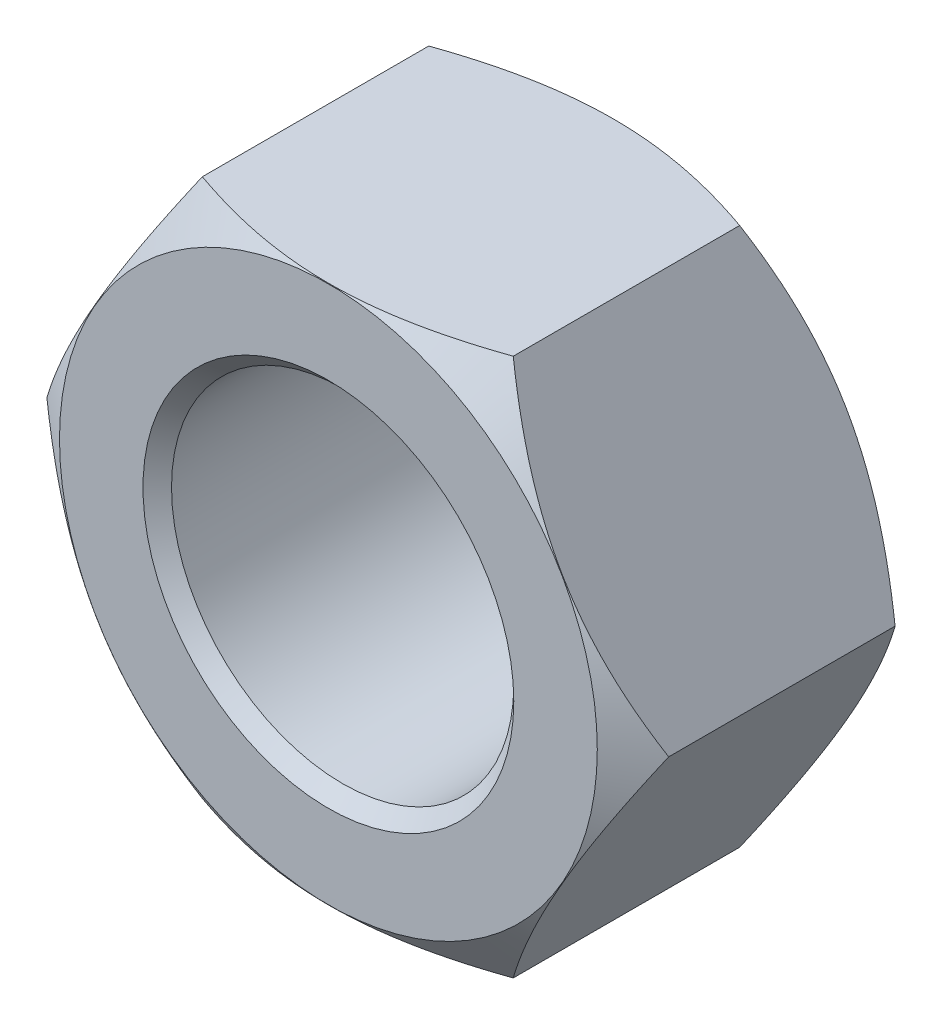
ISO-10303-21;
HEADER;
FILE_DESCRIPTION(('STEP AP214'),'2;1');
FILE_NAME('part.step','',(''),(''),'','','');
FILE_SCHEMA(('AUTOMOTIVE_DESIGN { 1 0 10303 214 1 1 1 1 }'));
ENDSEC;
DATA;
#1=APPLICATION_CONTEXT('core data for automotive mechanical design processes');
#2=APPLICATION_PROTOCOL_DEFINITION('international standard','automotive_design',2000,#1);
#3=PRODUCT_CONTEXT('',#1,'mechanical');
#4=PRODUCT('Part','Part','',(#3));
#5=PRODUCT_RELATED_PRODUCT_CATEGORY('part','',(#4));
#6=PRODUCT_DEFINITION_FORMATION('','',#4);
#7=PRODUCT_DEFINITION_CONTEXT('part definition',#1,'design');
#8=PRODUCT_DEFINITION('design','',#6,#7);
#9=PRODUCT_DEFINITION_SHAPE('','',#8);
#10=(LENGTH_UNIT() NAMED_UNIT(*) SI_UNIT(.MILLI.,.METRE.));
#11=(NAMED_UNIT(*) PLANE_ANGLE_UNIT() SI_UNIT($,.RADIAN.));
#12=(NAMED_UNIT(*) SI_UNIT($,.STERADIAN.) SOLID_ANGLE_UNIT());
#13=UNCERTAINTY_MEASURE_WITH_UNIT(LENGTH_MEASURE(1.E-05),#10,'distance_accuracy_value','');
#14=(GEOMETRIC_REPRESENTATION_CONTEXT(3) GLOBAL_UNCERTAINTY_ASSIGNED_CONTEXT((#13)) GLOBAL_UNIT_ASSIGNED_CONTEXT((#10,
#11,#12)) REPRESENTATION_CONTEXT('',''));
#15=CARTESIAN_POINT('',(0.,0.,0.));
#16=DIRECTION('',(0.,0.,1.));
#17=DIRECTION('',(1.,0.,0.));
#18=AXIS2_PLACEMENT_3D('',#15,#16,#17);
#19=CARTESIAN_POINT('',(5.45,0.,5.));
#20=DIRECTION('',(0.,0.,1.));
#21=DIRECTION('',(1.,0.,0.));
#22=AXIS2_PLACEMENT_3D('',#19,#20,#21);
#23=PLANE('',#22);
#24=CARTESIAN_POINT('',(0.,0.,5.));
#25=DIRECTION('',(0.,0.,1.));
#26=DIRECTION('',(1.,0.,0.));
#27=AXIS2_PLACEMENT_3D('',#24,#25,#26);
#28=CIRCLE('',#27,3.25);
#29=CARTESIAN_POINT('',(3.25,0.,5.));
#30=VERTEX_POINT('',#29);
#31=EDGE_CURVE('E94',#30,#30,#28,.F.);
#32=ORIENTED_EDGE('',*,*,#31,.T.);
#33=EDGE_LOOP('',(#32));
#34=FACE_BOUND('',#33,.T.);
#35=CARTESIAN_POINT('',(0.,0.,5.));
#36=DIRECTION('',(0.,0.,1.));
#37=DIRECTION('',(1.,0.,0.));
#38=AXIS2_PLACEMENT_3D('',#35,#36,#37);
#39=CIRCLE('',#38,4.71407400337105);
#40=CARTESIAN_POINT('',(4.71407400337105,0.,5.));
#41=VERTEX_POINT('',#40);
#42=EDGE_CURVE('E109',#41,#41,#39,.T.);
#43=ORIENTED_EDGE('',*,*,#42,.T.);
#44=EDGE_LOOP('',(#43));
#45=FACE_BOUND('',#44,.T.);
#46=ADVANCED_FACE('F31',(#34,#45),#23,.T.);
#47=CARTESIAN_POINT('',(5.45,0.,0.));
#48=DIRECTION('',(0.,0.,1.));
#49=DIRECTION('',(1.,0.,0.));
#50=AXIS2_PLACEMENT_3D('',#47,#48,#49);
#51=PLANE('',#50);
#52=CARTESIAN_POINT('',(0.,0.,0.));
#53=DIRECTION('',(0.,0.,1.));
#54=DIRECTION('',(1.,0.,0.));
#55=AXIS2_PLACEMENT_3D('',#52,#53,#54);
#56=CIRCLE('',#55,3.25);
#57=CARTESIAN_POINT('',(3.25,0.,0.));
#58=VERTEX_POINT('',#57);
#59=EDGE_CURVE('E121',#58,#58,#56,.T.);
#60=ORIENTED_EDGE('',*,*,#59,.T.);
#61=EDGE_LOOP('',(#60));
#62=FACE_BOUND('',#61,.T.);
#63=CARTESIAN_POINT('',(0.,0.,0.));
#64=DIRECTION('',(0.,0.,1.));
#65=DIRECTION('',(1.,0.,0.));
#66=AXIS2_PLACEMENT_3D('',#63,#64,#65);
#67=CIRCLE('',#66,4.71407400337105);
#68=CARTESIAN_POINT('',(4.71407400337105,0.,0.));
#69=VERTEX_POINT('',#68);
#70=EDGE_CURVE('E162',#69,#69,#67,.T.);
#71=ORIENTED_EDGE('',*,*,#70,.F.);
#72=EDGE_LOOP('',(#71));
#73=FACE_BOUND('',#72,.T.);
#74=ADVANCED_FACE('F141',(#62,#73),#51,.F.);
#75=CARTESIAN_POINT('',(0.,0.,5.));
#76=DIRECTION('',(0.,0.,-1.));
#77=DIRECTION('',(-1.,0.,0.));
#78=AXIS2_PLACEMENT_3D('',#75,#76,#77);
#79=CYLINDRICAL_SURFACE('',#78,3.);
#80=CARTESIAN_POINT('',(0.,0.,0.250000000000002));
#81=DIRECTION('',(0.,0.,1.));
#82=DIRECTION('',(1.,0.,0.));
#83=AXIS2_PLACEMENT_3D('',#80,#81,#82);
#84=CIRCLE('',#83,3.);
#85=CARTESIAN_POINT('',(3.,0.,0.250000000000002));
#86=VERTEX_POINT('',#85);
#87=EDGE_CURVE('E127',#86,#86,#84,.F.);
#88=ORIENTED_EDGE('',*,*,#87,.T.);
#89=EDGE_LOOP('',(#88));
#90=FACE_BOUND('',#89,.T.);
#91=CARTESIAN_POINT('',(0.,0.,4.75));
#92=DIRECTION('',(0.,0.,1.));
#93=DIRECTION('',(1.,0.,0.));
#94=AXIS2_PLACEMENT_3D('',#91,#92,#93);
#95=CIRCLE('',#94,3.);
#96=CARTESIAN_POINT('',(3.,0.,4.75));
#97=VERTEX_POINT('',#96);
#98=EDGE_CURVE('E124',#97,#97,#95,.T.);
#99=ORIENTED_EDGE('',*,*,#98,.T.);
#100=EDGE_LOOP('',(#99));
#101=FACE_BOUND('',#100,.T.);
#102=ADVANCED_FACE('F172',(#90,#101),#79,.F.);
#103=CARTESIAN_POINT('',(0.,0.,0.));
#104=DIRECTION('',(0.,0.,-1.));
#105=DIRECTION('',(-1.,0.,0.));
#106=AXIS2_PLACEMENT_3D('',#103,#104,#105);
#107=CONICAL_SURFACE('',#106,3.25,0.785398163397447);
#108=ORIENTED_EDGE('',*,*,#87,.F.);
#109=EDGE_LOOP('',(#108));
#110=FACE_BOUND('',#109,.T.);
#111=ORIENTED_EDGE('',*,*,#59,.F.);
#112=EDGE_LOOP('',(#111));
#113=FACE_BOUND('',#112,.T.);
#114=ADVANCED_FACE('F226',(#110,#113),#107,.F.);
#115=CARTESIAN_POINT('',(0.,0.,4.75));
#116=DIRECTION('',(0.,0.,1.));
#117=DIRECTION('',(1.,0.,0.));
#118=AXIS2_PLACEMENT_3D('',#115,#116,#117);
#119=CONICAL_SURFACE('',#118,3.,0.785398163397448);
#120=ORIENTED_EDGE('',*,*,#31,.F.);
#121=EDGE_LOOP('',(#120));
#122=FACE_BOUND('',#121,.T.);
#123=ORIENTED_EDGE('',*,*,#98,.F.);
#124=EDGE_LOOP('',(#123));
#125=FACE_BOUND('',#124,.T.);
#126=ADVANCED_FACE('F33',(#122,#125),#119,.F.);
#127=CARTESIAN_POINT('',(0.,0.,1.));
#128=DIRECTION('',(0.,0.,1.));
#129=DIRECTION('',(1.,0.,0.));
#130=AXIS2_PLACEMENT_3D('',#127,#128,#129);
#131=CONICAL_SURFACE('',#130,6.14222201011317,0.95993108859688);
#132=CARTESIAN_POINT('',(5.45011547005384,0.000200000000000892,0.51538178597573));
#133=CARTESIAN_POINT('',(5.32806298266113,-0.211201109354333,0.429875257771128));
#134=CARTESIAN_POINT('',(5.20441713391848,-0.425362001521569,0.351910218977452));
#135=CARTESIAN_POINT('',(4.95392092792557,-0.859234157404532,0.216021999788678));
#136=CARTESIAN_POINT('',(4.82706001745258,-1.0789636998382,0.158177582190663));
#137=CARTESIAN_POINT('',(4.63737775386296,-1.40750301767009,0.0915313335967001));
#138=CARTESIAN_POINT('',(4.57542778506908,-1.51480351114841,0.072847142210808));
#139=CARTESIAN_POINT('',(4.45113107877919,-1.73009172165595,0.0419433362488983));
#140=CARTESIAN_POINT('',(4.38878439782671,-1.83807934074893,0.0297228204039585));
#141=CARTESIAN_POINT('',(4.26396491361934,-2.05427302917065,0.0121245032834261));
#142=CARTESIAN_POINT('',(4.20149256858239,-2.16247830484261,0.00673386676484949));
#143=CARTESIAN_POINT('',(4.07650160442724,-2.37896900524636,0.00291227577913815));
#144=CARTESIAN_POINT('',(4.01398298812395,-2.48725442510255,0.00448092797565311));
#145=CARTESIAN_POINT('',(3.84850745573006,-2.77386645461829,0.0178251994942957));
#146=CARTESIAN_POINT('',(3.74565888362815,-2.95200540698469,0.035568412628076));
#147=CARTESIAN_POINT('',(3.54098563101521,-3.3065098794607,0.0885627146286807));
#148=CARTESIAN_POINT('',(3.43916259431045,-3.48287255241429,0.123838396457758));
#149=CARTESIAN_POINT('',(3.23397262247909,-3.83827200882984,0.210793032657014));
#150=CARTESIAN_POINT('',(3.13065789606793,-4.01721836414404,0.26295312718257));
#151=CARTESIAN_POINT('',(2.92619767293136,-4.37135385874345,0.380205016519062));
#152=CARTESIAN_POINT('',(2.82504662984925,-4.54655260460024,0.445257815681375));
#153=CARTESIAN_POINT('',(2.72488452994616,-4.72003845062519,0.51538178597573));
#154=B_SPLINE_CURVE_WITH_KNOTS('',3,(#132,#133,#134,#135,#136,#137,#138,#139,#140,#141,#142,
#143,#144,#145,#146,#147,#148,#149,#150,#151,#152,#153),.UNSPECIFIED.,.F.,.F.,(4,2,2,2,2,2,2,2,
2,2,4),(0.,0.776646405136946,1.55629967817505,1.93204572645042,2.30773936838684,
2.68272592513404,3.05769128805375,3.67619229306085,4.29556333435562,4.93442007936059,
5.57137322523636),.UNSPECIFIED.);
#155=CARTESIAN_POINT('',(5.45,0.,0.515300930404081));
#156=VERTEX_POINT('',#155);
#157=CARTESIAN_POINT('',(2.725,-4.71983845062519,0.515300930404081));
#158=VERTEX_POINT('',#157);
#159=EDGE_CURVE('E58',#156,#158,#154,.T.);
#160=ORIENTED_EDGE('',*,*,#159,.T.);
#161=CARTESIAN_POINT('',(-6.81549933400218,-4.71983845062519,2.50405107916546));
#162=CARTESIAN_POINT('',(-6.6319363758131,-4.71983845062519,2.39841045528963));
#163=CARTESIAN_POINT('',(-6.44779063980697,-4.71983845062519,2.29376557052065));
#164=CARTESIAN_POINT('',(-6.07804770974955,-4.71983845062519,2.08699233797309));
#165=CARTESIAN_POINT('',(-5.89245024895761,-4.71983845062519,1.98486446769545));
#166=CARTESIAN_POINT('',(-5.51840173102368,-4.71983845062519,1.78305106920375));
#167=CARTESIAN_POINT('',(-5.32994003377949,-4.71983845062519,1.68338519449122));
#168=CARTESIAN_POINT('',(-4.95101644919157,-4.71983845062519,1.48794469056976));
#169=CARTESIAN_POINT('',(-4.76055467263069,-4.71983845062519,1.39216984725539));
#170=CARTESIAN_POINT('',(-4.36897357823232,-4.71983845062519,1.20146388132905));
#171=CARTESIAN_POINT('',(-4.16774907135716,-4.71983845062519,1.10674758325985));
#172=CARTESIAN_POINT('',(-3.76219564181353,-4.71983845062519,0.924089696253005));
#173=CARTESIAN_POINT('',(-3.5578663151275,-4.71983845062519,0.836148998193066));
#174=CARTESIAN_POINT('',(-3.14610810049009,-4.71983845062519,0.669214402409238));
#175=CARTESIAN_POINT('',(-2.93868760060408,-4.71983845062519,0.590200016477395));
#176=CARTESIAN_POINT('',(-2.51993891353004,-4.71983845062519,0.443423810913389));
#177=CARTESIAN_POINT('',(-2.30861217801651,-4.71983845062519,0.375657900868084));
#178=CARTESIAN_POINT('',(-1.87203026844753,-4.71983845062519,0.251631862891754));
#179=CARTESIAN_POINT('',(-1.64658078996976,-4.71983845062519,0.196041924758221));
#180=CARTESIAN_POINT('',(-1.19170777967253,-4.71983845062519,0.104347645205094));
#181=CARTESIAN_POINT('',(-0.962285201331706,-4.71983845062519,0.0682386937581597));
#182=CARTESIAN_POINT('',(-0.504921020782125,-4.71983845062519,0.0191970388569941));
#183=CARTESIAN_POINT('',(-0.277022498127075,-4.71983845062519,0.00587406924510309));
#184=CARTESIAN_POINT('',(0.178961293247323,-4.71983845062519,0.00255518323427895));
#185=CARTESIAN_POINT('',(0.407046573883507,-4.71983845062519,0.0125608939678147));
#186=CARTESIAN_POINT('',(0.889730645580036,-4.71983845062519,0.057559758684813));
#187=CARTESIAN_POINT('',(1.14404475263258,-4.71983845062519,0.09554559954367));
#188=CARTESIAN_POINT('',(1.64788248279505,-4.71983845062519,0.195566732685661));
#189=CARTESIAN_POINT('',(1.89740366002046,-4.71983845062519,0.257613978619117));
#190=CARTESIAN_POINT('',(2.27050156837408,-4.71983845062519,0.365664494369776));
#191=CARTESIAN_POINT('',(2.39616157438818,-4.71983845062519,0.404737841358382));
#192=CARTESIAN_POINT('',(2.64606954541901,-4.71983845062519,0.487183364770451));
#193=CARTESIAN_POINT('',(2.77031749850196,-4.71983845062519,0.530555577495182));
#194=CARTESIAN_POINT('',(3.01742528016857,-4.71983845062519,0.620996825071467));
#195=CARTESIAN_POINT('',(3.1402853643281,-4.71983845062519,0.668065166155714));
#196=CARTESIAN_POINT('',(3.38472768943608,-4.71983845062519,0.765390049101635));
#197=CARTESIAN_POINT('',(3.50630996411629,-4.71983845062519,0.815646506555352));
#198=CARTESIAN_POINT('',(3.83727485410404,-4.71983845062519,0.956856715542681));
#199=CARTESIAN_POINT('',(4.04548309212691,-4.71983845062519,1.05056375253023));
#200=CARTESIAN_POINT('',(4.45892999078691,-4.71983845062519,1.2443402937526));
#201=CARTESIAN_POINT('',(4.66416817253115,-4.71983845062519,1.34441081030943));
#202=CARTESIAN_POINT('',(5.07226052656385,-4.71983845062519,1.54956781922297));
#203=CARTESIAN_POINT('',(5.27511326194285,-4.71983845062519,1.65465715940095));
#204=CARTESIAN_POINT('',(5.67872420850857,-4.71983845062519,1.86874298534786));
#205=CARTESIAN_POINT('',(5.87948253428784,-4.71983845062519,1.977739255892));
#206=CARTESIAN_POINT('',(6.27979292887348,-4.71983845062519,2.19914595683));
#207=CARTESIAN_POINT('',(6.47934043953832,-4.71983845062519,2.31156460885595));
#208=CARTESIAN_POINT('',(6.87698334531813,-4.71983845062519,2.538944658541));
#209=CARTESIAN_POINT('',(7.07507871154937,-4.71983845062519,2.65390610659556));
#210=CARTESIAN_POINT('',(7.66741763495769,-4.71983845062519,3.00180406780235));
#211=CARTESIAN_POINT('',(8.05984694022224,-4.71983845062519,3.23782858277738));
#212=CARTESIAN_POINT('',(8.79729479951332,-4.71983845062519,3.68866228897655));
#213=CARTESIAN_POINT('',(9.14268196667715,-4.71983845062519,3.90287225680481));
#214=CARTESIAN_POINT('',(9.83139977894484,-4.71983845062519,4.33463587592693));
#215=CARTESIAN_POINT('',(10.1747302449839,-4.71983845062519,4.55218981264528));
#216=CARTESIAN_POINT('',(10.857856712845,-4.71983845062519,4.98858713065129));
#217=CARTESIAN_POINT('',(11.1976617365941,-4.71983845062519,5.20741641856479));
#218=CARTESIAN_POINT('',(11.8759543835295,-4.71983845062519,5.64701800849159));
#219=CARTESIAN_POINT('',(12.2144421625757,-4.71983845062519,5.86779006988523));
#220=CARTESIAN_POINT('',(12.5524509158251,-4.71983845062519,6.08928708044306));
#221=B_SPLINE_CURVE_WITH_KNOTS('',3,(#161,#162,#163,#164,#165,#166,#167,#168,#169,#170,#171,
#172,#173,#174,#175,#176,#177,#178,#179,#180,#181,#182,#183,#184,#185,#186,#187,#188,#189,#190,
#191,#192,#193,#194,#195,#196,#197,#198,#199,#200,#201,#202,#203,#204,#205,#206,#207,#208,#209,
#210,#211,#212,#213,#214,#215,#216,#217,#218,#219,#220),.UNSPECIFIED.,.F.,.F.,(4,2,2,2,2,2,2,2,
2,2,2,2,2,2,2,2,2,2,2,2,2,2,2,2,2,2,2,2,2,4),(0.,0.635381537706067,1.2708826995182,
1.91042380979696,2.54992968129565,3.21703673558446,3.88423135409971,4.54986206188521,
5.21525018588999,5.911153514678,6.60689209092182,7.29059045158342,7.97433650037244,
8.74432950398932,9.51470552942002,9.90942888729514,10.3041555786495,10.6988083556638,
11.0934506882843,11.7782672599012,12.4631930481265,13.1485122104288,13.83379367775,
14.5208765447704,15.2079730412533,16.5817091745986,17.8009533355266,19.0203021494108,
20.2328062624954,21.445162258834),.UNSPECIFIED.);
#222=CARTESIAN_POINT('',(-2.725,-4.71983845062519,0.515300930404082));
#223=VERTEX_POINT('',#222);
#224=EDGE_CURVE('E44',#158,#223,#221,.F.);
#225=ORIENTED_EDGE('',*,*,#224,.T.);
#226=CARTESIAN_POINT('',(-2.72488452994617,-4.72003845062519,0.515381785975732));
#227=CARTESIAN_POINT('',(-2.84693701733888,-4.50863734127086,0.429875257771128));
#228=CARTESIAN_POINT('',(-2.97058286608152,-4.29447644910362,0.351910218977453));
#229=CARTESIAN_POINT('',(-3.22107907207443,-3.86060429322066,0.216021999788679));
#230=CARTESIAN_POINT('',(-3.34793998254742,-3.64087475078699,0.158177582190665));
#231=CARTESIAN_POINT('',(-3.53762224613704,-3.3123354329551,0.0915313335967015));
#232=CARTESIAN_POINT('',(-3.59957221493093,-3.20503493947678,0.0728471422108092));
#233=CARTESIAN_POINT('',(-3.72386892122081,-2.98974672896924,0.0419433362488993));
#234=CARTESIAN_POINT('',(-3.78621560217329,-2.88175910987626,0.0297228204039596));
#235=CARTESIAN_POINT('',(-3.91103508638067,-2.66556542145454,0.0121245032834271));
#236=CARTESIAN_POINT('',(-3.97350743141761,-2.55736014578257,0.00673386676485044));
#237=CARTESIAN_POINT('',(-4.09849839557276,-2.34086944537883,0.00291227577913926));
#238=CARTESIAN_POINT('',(-4.16101701187605,-2.23258402552264,0.00448092797565446));
#239=CARTESIAN_POINT('',(-4.32649254426994,-1.9459719960069,0.0178251994942973));
#240=CARTESIAN_POINT('',(-4.42934111637185,-1.76783304364049,0.0355684126280775));
#241=CARTESIAN_POINT('',(-4.63401436898479,-1.41332857116449,0.0885627146286823));
#242=CARTESIAN_POINT('',(-4.73583740568955,-1.2369658982109,0.12383839645776));
#243=CARTESIAN_POINT('',(-4.94102737752091,-0.881566441795349,0.210793032657016));
#244=CARTESIAN_POINT('',(-5.04434210393207,-0.702620086481146,0.262953127182572));
#245=CARTESIAN_POINT('',(-5.24880232706864,-0.348484591881734,0.380205016519064));
#246=CARTESIAN_POINT('',(-5.34995337015075,-0.173285846024942,0.445257815681376));
#247=CARTESIAN_POINT('',(-5.45011547005384,0.000200000000001074,0.515381785975731));
#248=B_SPLINE_CURVE_WITH_KNOTS('',3,(#226,#227,#228,#229,#230,#231,#232,#233,#234,#235,#236,
#237,#238,#239,#240,#241,#242,#243,#244,#245,#246,#247),.UNSPECIFIED.,.F.,.F.,(4,2,2,2,2,2,2,2,
2,2,4),(0.,0.776646405136946,1.55629967817505,1.93204572645042,2.30773936838684,
2.68272592513404,3.05769128805375,3.67619229306085,4.29556333435562,4.93442007936059,
5.57137322523636),.UNSPECIFIED.);
#249=CARTESIAN_POINT('',(-5.45,0.,0.515300930404082));
#250=VERTEX_POINT('',#249);
#251=EDGE_CURVE('E88',#223,#250,#248,.T.);
#252=ORIENTED_EDGE('',*,*,#251,.T.);
#253=CARTESIAN_POINT('',(-5.45011547005384,-0.00019999999999874,0.515381785975731));
#254=CARTESIAN_POINT('',(-5.32806298266113,0.211201109354336,0.429875257771128));
#255=CARTESIAN_POINT('',(-5.20441713391848,0.425362001521571,0.351910218977452));
#256=CARTESIAN_POINT('',(-4.95392092792557,0.859234157404534,0.216021999788679));
#257=CARTESIAN_POINT('',(-4.82706001745258,1.0789636998382,0.158177582190664));
#258=CARTESIAN_POINT('',(-4.63737775386296,1.40750301767009,0.0915313335967008));
#259=CARTESIAN_POINT('',(-4.57542778506908,1.51480351114841,0.0728471422108086));
#260=CARTESIAN_POINT('',(-4.45113107877919,1.73009172165595,0.0419433362488988));
#261=CARTESIAN_POINT('',(-4.38878439782671,1.83807934074893,0.0297228204039591));
#262=CARTESIAN_POINT('',(-4.26396491361933,2.05427302917065,0.0121245032834263));
#263=CARTESIAN_POINT('',(-4.20149256858239,2.16247830484262,0.00673386676484947));
#264=CARTESIAN_POINT('',(-4.07650160442724,2.37896900524636,0.00291227577913825));
#265=CARTESIAN_POINT('',(-4.01398298812395,2.48725442510255,0.00448092797565358));
#266=CARTESIAN_POINT('',(-3.84850745573006,2.77386645461829,0.0178251994942967));
#267=CARTESIAN_POINT('',(-3.74565888362815,2.9520054069847,0.0355684126280769));
#268=CARTESIAN_POINT('',(-3.54098563101521,3.3065098794607,0.0885627146286816));
#269=CARTESIAN_POINT('',(-3.43916259431045,3.48287255241429,0.123838396457759));
#270=CARTESIAN_POINT('',(-3.23397262247909,3.83827200882984,0.210793032657015));
#271=CARTESIAN_POINT('',(-3.13065789606793,4.01721836414404,0.262953127182571));
#272=CARTESIAN_POINT('',(-2.92619767293136,4.37135385874346,0.380205016519063));
#273=CARTESIAN_POINT('',(-2.82504662984925,4.54655260460025,0.445257815681376));
#274=CARTESIAN_POINT('',(-2.72488452994616,4.72003845062519,0.515381785975731));
#275=B_SPLINE_CURVE_WITH_KNOTS('',3,(#253,#254,#255,#256,#257,#258,#259,#260,#261,#262,#263,
#264,#265,#266,#267,#268,#269,#270,#271,#272,#273,#274),.UNSPECIFIED.,.F.,.F.,(4,2,2,2,2,2,2,2,
2,2,4),(0.,0.776646405136946,1.55629967817505,1.93204572645042,2.30773936838684,
2.68272592513404,3.05769128805375,3.67619229306085,4.29556333435561,4.93442007936059,
5.57137322523636),.UNSPECIFIED.);
#276=CARTESIAN_POINT('',(-2.725,4.71983845062519,0.515300930404081));
#277=VERTEX_POINT('',#276);
#278=EDGE_CURVE('E102',#250,#277,#275,.T.);
#279=ORIENTED_EDGE('',*,*,#278,.T.);
#280=CARTESIAN_POINT('',(-6.81549933400217,4.71983845062519,2.50405107916545));
#281=CARTESIAN_POINT('',(-6.63193637581309,4.71983845062519,2.39841045528962));
#282=CARTESIAN_POINT('',(-6.44779063980696,4.71983845062519,2.29376557052064));
#283=CARTESIAN_POINT('',(-6.07804770974954,4.71983845062519,2.08699233797309));
#284=CARTESIAN_POINT('',(-5.8924502489576,4.71983845062519,1.98486446769545));
#285=CARTESIAN_POINT('',(-5.51840173102367,4.71983845062519,1.78305106920375));
#286=CARTESIAN_POINT('',(-5.32994003377948,4.71983845062519,1.68338519449122));
#287=CARTESIAN_POINT('',(-4.95101644919156,4.71983845062519,1.48794469056975));
#288=CARTESIAN_POINT('',(-4.76055467263068,4.71983845062519,1.39216984725539));
#289=CARTESIAN_POINT('',(-4.36897357823231,4.71983845062519,1.20146388132905));
#290=CARTESIAN_POINT('',(-4.16774907135715,4.71983845062519,1.10674758325985));
#291=CARTESIAN_POINT('',(-3.76219564181352,4.71983845062519,0.924089696253002));
#292=CARTESIAN_POINT('',(-3.55786631512749,4.71983845062519,0.836148998193063));
#293=CARTESIAN_POINT('',(-3.14610810049008,4.71983845062519,0.669214402409235));
#294=CARTESIAN_POINT('',(-2.93868760060408,4.71983845062519,0.590200016477393));
#295=CARTESIAN_POINT('',(-2.51993891353003,4.71983845062519,0.443423810913388));
#296=CARTESIAN_POINT('',(-2.30861217801651,4.71983845062519,0.375657900868084));
#297=CARTESIAN_POINT('',(-1.87203026844753,4.71983845062519,0.251631862891754));
#298=CARTESIAN_POINT('',(-1.64658078996976,4.71983845062519,0.19604192475822));
#299=CARTESIAN_POINT('',(-1.19170777967253,4.71983845062519,0.104347645205094));
#300=CARTESIAN_POINT('',(-0.962285201331704,4.71983845062519,0.0682386937581599));
#301=CARTESIAN_POINT('',(-0.504921020782124,4.71983845062519,0.0191970388569947));
#302=CARTESIAN_POINT('',(-0.277022498127074,4.71983845062519,0.00587406924510362));
#303=CARTESIAN_POINT('',(0.178961293247325,4.71983845062519,0.00255518323427909));
#304=CARTESIAN_POINT('',(0.407046573883509,4.71983845062519,0.0125608939678145));
#305=CARTESIAN_POINT('',(0.889730645580038,4.71983845062519,0.057559758684813));
#306=CARTESIAN_POINT('',(1.14404475263258,4.71983845062519,0.0955455995436706));
#307=CARTESIAN_POINT('',(1.64788248279505,4.71983845062519,0.195566732685662));
#308=CARTESIAN_POINT('',(1.89740366002046,4.71983845062519,0.257613978619117));
#309=CARTESIAN_POINT('',(2.27050156837409,4.71983845062519,0.365664494369777));
#310=CARTESIAN_POINT('',(2.39616157438819,4.71983845062519,0.404737841358384));
#311=CARTESIAN_POINT('',(2.64606954541902,4.71983845062519,0.487183364770453));
#312=CARTESIAN_POINT('',(2.77031749850196,4.71983845062519,0.530555577495184));
#313=CARTESIAN_POINT('',(3.01742528016857,4.71983845062519,0.620996825071468));
#314=CARTESIAN_POINT('',(3.14028536432811,4.71983845062519,0.668065166155716));
#315=CARTESIAN_POINT('',(3.38472768943608,4.71983845062519,0.765390049101637));
#316=CARTESIAN_POINT('',(3.50630996411629,4.71983845062519,0.815646506555354));
#317=CARTESIAN_POINT('',(3.83727485410405,4.71983845062519,0.956856715542684));
#318=CARTESIAN_POINT('',(4.04548309212692,4.71983845062519,1.05056375253023));
#319=CARTESIAN_POINT('',(4.45892999078691,4.71983845062519,1.2443402937526));
#320=CARTESIAN_POINT('',(4.66416817253115,4.71983845062519,1.34441081030943));
#321=CARTESIAN_POINT('',(5.07226052656386,4.71983845062519,1.54956781922297));
#322=CARTESIAN_POINT('',(5.27511326194285,4.71983845062519,1.65465715940095));
#323=CARTESIAN_POINT('',(5.67872420850858,4.71983845062519,1.86874298534786));
#324=CARTESIAN_POINT('',(5.87948253428784,4.71983845062519,1.977739255892));
#325=CARTESIAN_POINT('',(6.27979292887348,4.71983845062519,2.19914595683));
#326=CARTESIAN_POINT('',(6.47934043953833,4.71983845062519,2.31156460885596));
#327=CARTESIAN_POINT('',(6.87698334531813,4.71983845062519,2.53894465854101));
#328=CARTESIAN_POINT('',(7.07507871154937,4.71983845062519,2.65390610659557));
#329=CARTESIAN_POINT('',(7.66741763495769,4.71983845062519,3.00180406780235));
#330=CARTESIAN_POINT('',(8.05984694022224,4.71983845062519,3.23782858277738));
#331=CARTESIAN_POINT('',(8.79729479951332,4.71983845062519,3.68866228897655));
#332=CARTESIAN_POINT('',(9.14268196667715,4.71983845062519,3.90287225680481));
#333=CARTESIAN_POINT('',(9.83139977894484,4.71983845062519,4.33463587592693));
#334=CARTESIAN_POINT('',(10.174730244984,4.71983845062519,4.55218981264529));
#335=CARTESIAN_POINT('',(10.857856712845,4.71983845062519,4.9885871306513));
#336=CARTESIAN_POINT('',(11.1976617365941,4.71983845062519,5.20741641856479));
#337=CARTESIAN_POINT('',(11.8759543835295,4.71983845062519,5.6470180084916));
#338=CARTESIAN_POINT('',(12.2144421625757,4.71983845062519,5.86779006988523));
#339=CARTESIAN_POINT('',(12.5524509158251,4.71983845062519,6.08928708044307));
#340=B_SPLINE_CURVE_WITH_KNOTS('',3,(#280,#281,#282,#283,#284,#285,#286,#287,#288,#289,#290,
#291,#292,#293,#294,#295,#296,#297,#298,#299,#300,#301,#302,#303,#304,#305,#306,#307,#308,#309,
#310,#311,#312,#313,#314,#315,#316,#317,#318,#319,#320,#321,#322,#323,#324,#325,#326,#327,#328,
#329,#330,#331,#332,#333,#334,#335,#336,#337,#338,#339),.UNSPECIFIED.,.F.,.F.,(4,2,2,2,2,2,2,2,
2,2,2,2,2,2,2,2,2,2,2,2,2,2,2,2,2,2,2,2,2,4),(0.,0.635381537706066,1.27088269951819,
1.91042380979696,2.54992968129565,3.21703673558446,3.88423135409971,4.54986206188521,
5.21525018588998,5.91115351467799,6.60689209092181,7.29059045158341,7.97433650037242,
8.74432950398931,9.51470552942001,9.90942888729513,10.3041555786495,10.6988083556638,
11.0934506882843,11.7782672599012,12.4631930481265,13.1485122104288,13.83379367775,
14.5208765447703,15.2079730412533,16.5817091745986,17.8009533355266,19.0203021494108,
20.2328062624954,21.445162258834),.UNSPECIFIED.);
#341=CARTESIAN_POINT('',(2.725,4.71983845062519,0.515300930404082));
#342=VERTEX_POINT('',#341);
#343=EDGE_CURVE('E209',#277,#342,#340,.T.);
#344=ORIENTED_EDGE('',*,*,#343,.T.);
#345=CARTESIAN_POINT('',(2.72488452994616,4.72003845062519,0.515381785975731));
#346=CARTESIAN_POINT('',(2.84693701733887,4.50863734127086,0.429875257771128));
#347=CARTESIAN_POINT('',(2.97058286608152,4.29447644910362,0.351910218977453));
#348=CARTESIAN_POINT('',(3.22107907207443,3.86060429322066,0.216021999788679));
#349=CARTESIAN_POINT('',(3.34793998254742,3.64087475078699,0.158177582190665));
#350=CARTESIAN_POINT('',(3.53762224613704,3.3123354329551,0.0915313335967011));
#351=CARTESIAN_POINT('',(3.59957221493092,3.20503493947678,0.0728471422108087));
#352=CARTESIAN_POINT('',(3.72386892122081,2.98974672896924,0.041943336248899));
#353=CARTESIAN_POINT('',(3.78621560217329,2.88175910987626,0.0297228204039595));
#354=CARTESIAN_POINT('',(3.91103508638067,2.66556542145454,0.0121245032834272));
#355=CARTESIAN_POINT('',(3.97350743141761,2.55736014578257,0.0067338667648505));
#356=CARTESIAN_POINT('',(4.09849839557276,2.34086944537883,0.00291227577913918));
#357=CARTESIAN_POINT('',(4.16101701187605,2.23258402552264,0.00448092797565426));
#358=CARTESIAN_POINT('',(4.32649254426994,1.9459719960069,0.017825199494297));
#359=CARTESIAN_POINT('',(4.42934111637185,1.76783304364049,0.0355684126280772));
#360=CARTESIAN_POINT('',(4.63401436898479,1.41332857116449,0.0885627146286819));
#361=CARTESIAN_POINT('',(4.73583740568955,1.2369658982109,0.123838396457759));
#362=CARTESIAN_POINT('',(4.94102737752091,0.881566441795351,0.210793032657015));
#363=CARTESIAN_POINT('',(5.04434210393207,0.702620086481148,0.262953127182572));
#364=CARTESIAN_POINT('',(5.24880232706864,0.348484591881736,0.380205016519064));
#365=CARTESIAN_POINT('',(5.34995337015075,0.173285846024944,0.445257815681376));
#366=CARTESIAN_POINT('',(5.45011547005384,-0.000199999999998901,0.515381785975731));
#367=B_SPLINE_CURVE_WITH_KNOTS('',3,(#345,#346,#347,#348,#349,#350,#351,#352,#353,#354,#355,
#356,#357,#358,#359,#360,#361,#362,#363,#364,#365,#366),.UNSPECIFIED.,.F.,.F.,(4,2,2,2,2,2,2,2,
2,2,4),(0.,0.776646405136946,1.55629967817505,1.93204572645042,2.30773936838684,
2.68272592513404,3.05769128805375,3.67619229306085,4.29556333435561,4.93442007936059,
5.57137322523636),.UNSPECIFIED.);
#368=EDGE_CURVE('E204',#342,#156,#367,.T.);
#369=ORIENTED_EDGE('',*,*,#368,.T.);
#370=EDGE_LOOP('',(#160,#225,#252,#279,#344,#369));
#371=FACE_BOUND('',#370,.T.);
#372=ORIENTED_EDGE('',*,*,#70,.T.);
#373=EDGE_LOOP('',(#372));
#374=FACE_BOUND('',#373,.T.);
#375=ADVANCED_FACE('F86',(#371,#374),#131,.T.);
#376=CARTESIAN_POINT('',(0.,0.,5.5));
#377=DIRECTION('',(0.,0.,-1.));
#378=DIRECTION('',(-1.,0.,0.));
#379=AXIS2_PLACEMENT_3D('',#376,#377,#378);
#380=CONICAL_SURFACE('',#379,4.,0.95993108859688);
#381=ORIENTED_EDGE('',*,*,#42,.F.);
#382=EDGE_LOOP('',(#381));
#383=FACE_BOUND('',#382,.T.);
#384=CARTESIAN_POINT('',(2.72488452994616,-4.72003845062519,4.48461821402427));
#385=CARTESIAN_POINT('',(2.84693701733887,-4.50863734127085,4.57012474222887));
#386=CARTESIAN_POINT('',(2.97058286608152,-4.29447644910362,4.64808978102255));
#387=CARTESIAN_POINT('',(3.22107907207443,-3.86060429322066,4.78397800021132));
#388=CARTESIAN_POINT('',(3.34793998254742,-3.64087475078699,4.84182241780934));
#389=CARTESIAN_POINT('',(3.53762224613704,-3.3123354329551,4.9084686664033));
#390=CARTESIAN_POINT('',(3.59957221493092,-3.20503493947678,4.92715285778919));
#391=CARTESIAN_POINT('',(3.7238689212208,-2.98974672896924,4.9580566637511));
#392=CARTESIAN_POINT('',(3.78621560217328,-2.88175910987626,4.97027717959604));
#393=CARTESIAN_POINT('',(3.91103508638066,-2.66556542145454,4.98787549671657));
#394=CARTESIAN_POINT('',(3.97350743141761,-2.55736014578258,4.99326613323515));
#395=CARTESIAN_POINT('',(4.09849839557276,-2.34086944537883,4.99708772422086));
#396=CARTESIAN_POINT('',(4.16101701187604,-2.23258402552264,4.99551907202435));
#397=CARTESIAN_POINT('',(4.32649254426994,-1.9459719960069,4.9821748005057));
#398=CARTESIAN_POINT('',(4.42934111637184,-1.7678330436405,4.96443158737192));
#399=CARTESIAN_POINT('',(4.63401436898479,-1.41332857116449,4.91143728537132));
#400=CARTESIAN_POINT('',(4.73583740568955,-1.2369658982109,4.87616160354224));
#401=CARTESIAN_POINT('',(4.94102737752091,-0.881566441795351,4.78920696734298));
#402=CARTESIAN_POINT('',(5.04434210393207,-0.702620086481148,4.73704687281743));
#403=CARTESIAN_POINT('',(5.24880232706864,-0.348484591881735,4.61979498348094));
#404=CARTESIAN_POINT('',(5.34995337015074,-0.173285846024943,4.55474218431862));
#405=CARTESIAN_POINT('',(5.45011547005384,0.000200000000000773,4.48461821402427));
#406=B_SPLINE_CURVE_WITH_KNOTS('',3,(#384,#385,#386,#387,#388,#389,#390,#391,#392,#393,#394,
#395,#396,#397,#398,#399,#400,#401,#402,#403,#404,#405),.UNSPECIFIED.,.F.,.F.,(4,2,2,2,2,2,2,2,
2,2,4),(0.,0.776646405136945,1.55629967817505,1.93204572645042,2.30773936838684,
2.68272592513404,3.05769128805374,3.67619229306085,4.29556333435561,4.93442007936059,
5.57137322523636),.UNSPECIFIED.);
#407=CARTESIAN_POINT('',(2.725,-4.71983845062519,4.48469906959592));
#408=VERTEX_POINT('',#407);
#409=CARTESIAN_POINT('',(5.45,0.,4.48469906959592));
#410=VERTEX_POINT('',#409);
#411=EDGE_CURVE('E189',#408,#410,#406,.T.);
#412=ORIENTED_EDGE('',*,*,#411,.T.);
#413=CARTESIAN_POINT('',(5.45011547005384,-0.000199999999999145,4.48461821402427));
#414=CARTESIAN_POINT('',(5.32806298266113,0.211201109354335,4.57012474222887));
#415=CARTESIAN_POINT('',(5.20441713391848,0.42536200152157,4.64808978102255));
#416=CARTESIAN_POINT('',(4.95392092792557,0.859234157404533,4.78397800021132));
#417=CARTESIAN_POINT('',(4.82706001745258,1.0789636998382,4.84182241780934));
#418=CARTESIAN_POINT('',(4.63737775386296,1.40750301767009,4.9084686664033));
#419=CARTESIAN_POINT('',(4.57542778506908,1.51480351114841,4.92715285778919));
#420=CARTESIAN_POINT('',(4.45113107877919,1.73009172165595,4.9580566637511));
#421=CARTESIAN_POINT('',(4.38878439782671,1.83807934074893,4.97027717959604));
#422=CARTESIAN_POINT('',(4.26396491361934,2.05427302917065,4.98787549671657));
#423=CARTESIAN_POINT('',(4.20149256858239,2.16247830484261,4.99326613323515));
#424=CARTESIAN_POINT('',(4.07650160442724,2.37896900524636,4.99708772422086));
#425=CARTESIAN_POINT('',(4.01398298812395,2.48725442510255,4.99551907202434));
#426=CARTESIAN_POINT('',(3.84850745573006,2.77386645461829,4.9821748005057));
#427=CARTESIAN_POINT('',(3.74565888362816,2.9520054069847,4.96443158737192));
#428=CARTESIAN_POINT('',(3.54098563101521,3.3065098794607,4.91143728537132));
#429=CARTESIAN_POINT('',(3.43916259431045,3.48287255241429,4.87616160354224));
#430=CARTESIAN_POINT('',(3.23397262247909,3.83827200882984,4.78920696734298));
#431=CARTESIAN_POINT('',(3.13065789606793,4.01721836414404,4.73704687281743));
#432=CARTESIAN_POINT('',(2.92619767293136,4.37135385874346,4.61979498348093));
#433=CARTESIAN_POINT('',(2.82504662984925,4.54655260460025,4.55474218431862));
#434=CARTESIAN_POINT('',(2.72488452994616,4.72003845062519,4.48461821402427));
#435=B_SPLINE_CURVE_WITH_KNOTS('',3,(#413,#414,#415,#416,#417,#418,#419,#420,#421,#422,#423,
#424,#425,#426,#427,#428,#429,#430,#431,#432,#433,#434),.UNSPECIFIED.,.F.,.F.,(4,2,2,2,2,2,2,2,
2,2,4),(0.,0.776646405136945,1.55629967817505,1.93204572645042,2.30773936838684,
2.68272592513404,3.05769128805375,3.67619229306085,4.29556333435562,4.93442007936059,
5.57137322523636),.UNSPECIFIED.);
#436=CARTESIAN_POINT('',(2.725,4.71983845062519,4.48469906959592));
#437=VERTEX_POINT('',#436);
#438=EDGE_CURVE('E184',#410,#437,#435,.T.);
#439=ORIENTED_EDGE('',*,*,#438,.T.);
#440=CARTESIAN_POINT('',(-6.81549933400217,4.71983845062519,2.49594892083455));
#441=CARTESIAN_POINT('',(-6.63193637581309,4.71983845062519,2.60158954471038));
#442=CARTESIAN_POINT('',(-6.44779063980696,4.71983845062519,2.70623442947936));
#443=CARTESIAN_POINT('',(-6.07804770974954,4.71983845062519,2.91300766202691));
#444=CARTESIAN_POINT('',(-5.8924502489576,4.71983845062519,3.01513553230456));
#445=CARTESIAN_POINT('',(-5.51840173102367,4.71983845062519,3.21694893079625));
#446=CARTESIAN_POINT('',(-5.32994003377948,4.71983845062519,3.31661480550878));
#447=CARTESIAN_POINT('',(-4.95101644919156,4.71983845062519,3.51205530943025));
#448=CARTESIAN_POINT('',(-4.76055467263068,4.71983845062519,3.60783015274461));
#449=CARTESIAN_POINT('',(-4.36897357823231,4.71983845062519,3.79853611867095));
#450=CARTESIAN_POINT('',(-4.16774907135715,4.71983845062519,3.89325241674015));
#451=CARTESIAN_POINT('',(-3.76219564181352,4.71983845062519,4.075910303747));
#452=CARTESIAN_POINT('',(-3.55786631512749,4.71983845062519,4.16385100180694));
#453=CARTESIAN_POINT('',(-3.14610810049008,4.71983845062519,4.33078559759076));
#454=CARTESIAN_POINT('',(-2.93868760060408,4.71983845062519,4.40979998352261));
#455=CARTESIAN_POINT('',(-2.51993891353003,4.71983845062519,4.55657618908661));
#456=CARTESIAN_POINT('',(-2.30861217801651,4.71983845062519,4.62434209913192));
#457=CARTESIAN_POINT('',(-1.87203026844753,4.71983845062519,4.74836813710825));
#458=CARTESIAN_POINT('',(-1.64658078996976,4.71983845062519,4.80395807524178));
#459=CARTESIAN_POINT('',(-1.19170777967253,4.71983845062519,4.89565235479491));
#460=CARTESIAN_POINT('',(-0.962285201331702,4.71983845062519,4.93176130624184));
#461=CARTESIAN_POINT('',(-0.504921020782122,4.71983845062519,4.980802961143));
#462=CARTESIAN_POINT('',(-0.277022498127072,4.71983845062519,4.9941259307549));
#463=CARTESIAN_POINT('',(0.178961293247327,4.71983845062519,4.99744481676572));
#464=CARTESIAN_POINT('',(0.407046573883511,4.71983845062519,4.98743910603218));
#465=CARTESIAN_POINT('',(0.889730645580041,4.71983845062519,4.94244024131519));
#466=CARTESIAN_POINT('',(1.14404475263258,4.71983845062519,4.90445440045633));
#467=CARTESIAN_POINT('',(1.64788248279505,4.71983845062519,4.80443326731434));
#468=CARTESIAN_POINT('',(1.89740366002046,4.71983845062519,4.74238602138088));
#469=CARTESIAN_POINT('',(2.27050156837409,4.71983845062519,4.63433550563022));
#470=CARTESIAN_POINT('',(2.39616157438819,4.71983845062519,4.59526215864161));
#471=CARTESIAN_POINT('',(2.64606954541902,4.71983845062519,4.51281663522954));
#472=CARTESIAN_POINT('',(2.77031749850196,4.71983845062519,4.46944442250481));
#473=CARTESIAN_POINT('',(3.01742528016858,4.71983845062519,4.37900317492853));
#474=CARTESIAN_POINT('',(3.14028536432811,4.71983845062519,4.33193483384428));
#475=CARTESIAN_POINT('',(3.38472768943609,4.71983845062519,4.23460995089836));
#476=CARTESIAN_POINT('',(3.5063099641163,4.71983845062519,4.18435349344464));
#477=CARTESIAN_POINT('',(3.83727485410405,4.71983845062519,4.04314328445731));
#478=CARTESIAN_POINT('',(4.04548309212692,4.71983845062519,3.94943624746977));
#479=CARTESIAN_POINT('',(4.45892999078692,4.71983845062519,3.7556597062474));
#480=CARTESIAN_POINT('',(4.66416817253116,4.71983845062519,3.65558918969057));
#481=CARTESIAN_POINT('',(5.07226052656386,4.71983845062519,3.45043218077703));
#482=CARTESIAN_POINT('',(5.27511326194286,4.71983845062519,3.34534284059904));
#483=CARTESIAN_POINT('',(5.67872420850858,4.71983845062519,3.13125701465214));
#484=CARTESIAN_POINT('',(5.87948253428785,4.71983845062519,3.022260744108));
#485=CARTESIAN_POINT('',(6.27979292887349,4.71983845062519,2.80085404316999));
#486=CARTESIAN_POINT('',(6.47934043953833,4.71983845062519,2.68843539114404));
#487=CARTESIAN_POINT('',(6.87698334531814,4.71983845062519,2.46105534145899));
#488=CARTESIAN_POINT('',(7.07507871154938,4.71983845062519,2.34609389340443));
#489=CARTESIAN_POINT('',(7.6674176349577,4.71983845062519,1.99819593219765));
#490=CARTESIAN_POINT('',(8.05984694022225,4.71983845062519,1.76217141722261));
#491=CARTESIAN_POINT('',(8.79729479951333,4.71983845062519,1.31133771102345));
#492=CARTESIAN_POINT('',(9.14268196667716,4.71983845062519,1.09712774319518));
#493=CARTESIAN_POINT('',(9.83139977894485,4.71983845062519,0.665364124073066));
#494=CARTESIAN_POINT('',(10.174730244984,4.71983845062519,0.447810187354713));
#495=CARTESIAN_POINT('',(10.857856712845,4.71983845062519,0.0114128693487053));
#496=CARTESIAN_POINT('',(11.1976617365941,4.71983845062519,-0.207416418564792));
#497=CARTESIAN_POINT('',(11.8759543835295,4.71983845062519,-0.647018008491597));
#498=CARTESIAN_POINT('',(12.2144421625758,4.71983845062519,-0.867790069885236));
#499=CARTESIAN_POINT('',(12.5524509158251,4.71983845062519,-1.08928708044307));
#500=B_SPLINE_CURVE_WITH_KNOTS('',3,(#440,#441,#442,#443,#444,#445,#446,#447,#448,#449,#450,
#451,#452,#453,#454,#455,#456,#457,#458,#459,#460,#461,#462,#463,#464,#465,#466,#467,#468,#469,
#470,#471,#472,#473,#474,#475,#476,#477,#478,#479,#480,#481,#482,#483,#484,#485,#486,#487,#488,
#489,#490,#491,#492,#493,#494,#495,#496,#497,#498,#499),.UNSPECIFIED.,.F.,.F.,(4,2,2,2,2,2,2,2,
2,2,2,2,2,2,2,2,2,2,2,2,2,2,2,2,2,2,2,2,2,4),(0.,0.635381537706066,1.27088269951819,
1.91042380979696,2.54992968129565,3.21703673558446,3.88423135409971,4.54986206188521,
5.21525018588998,5.91115351467799,6.60689209092181,7.29059045158341,7.97433650037243,
8.74432950398931,9.51470552942001,9.90942888729514,10.3041555786495,10.6988083556638,
11.0934506882843,11.7782672599012,12.4631930481265,13.1485122104288,13.83379367775,
14.5208765447704,15.2079730412533,16.5817091745986,17.8009533355266,19.0203021494108,
20.2328062624954,21.445162258834),.UNSPECIFIED.);
#501=CARTESIAN_POINT('',(-2.725,4.71983845062519,4.48469906959592));
#502=VERTEX_POINT('',#501);
#503=EDGE_CURVE('E179',#437,#502,#500,.F.);
#504=ORIENTED_EDGE('',*,*,#503,.T.);
#505=CARTESIAN_POINT('',(-2.72488452994616,4.72003845062519,4.48461821402427));
#506=CARTESIAN_POINT('',(-2.84693701733887,4.50863734127086,4.57012474222887));
#507=CARTESIAN_POINT('',(-2.97058286608152,4.29447644910362,4.64808978102255));
#508=CARTESIAN_POINT('',(-3.22107907207443,3.86060429322066,4.78397800021132));
#509=CARTESIAN_POINT('',(-3.34793998254742,3.64087475078699,4.84182241780934));
#510=CARTESIAN_POINT('',(-3.53762224613704,3.3123354329551,4.9084686664033));
#511=CARTESIAN_POINT('',(-3.59957221493092,3.20503493947678,4.92715285778919));
#512=CARTESIAN_POINT('',(-3.72386892122081,2.98974672896924,4.9580566637511));
#513=CARTESIAN_POINT('',(-3.78621560217329,2.88175910987626,4.97027717959604));
#514=CARTESIAN_POINT('',(-3.91103508638066,2.66556542145454,4.98787549671657));
#515=CARTESIAN_POINT('',(-3.97350743141761,2.55736014578258,4.99326613323515));
#516=CARTESIAN_POINT('',(-4.09849839557276,2.34086944537883,4.99708772422086));
#517=CARTESIAN_POINT('',(-4.16101701187605,2.23258402552264,4.99551907202435));
#518=CARTESIAN_POINT('',(-4.32649254426994,1.9459719960069,4.9821748005057));
#519=CARTESIAN_POINT('',(-4.42934111637185,1.76783304364049,4.96443158737192));
#520=CARTESIAN_POINT('',(-4.63401436898479,1.41332857116449,4.91143728537132));
#521=CARTESIAN_POINT('',(-4.73583740568955,1.2369658982109,4.87616160354224));
#522=CARTESIAN_POINT('',(-4.94102737752091,0.881566441795351,4.78920696734298));
#523=CARTESIAN_POINT('',(-5.04434210393207,0.702620086481148,4.73704687281743));
#524=CARTESIAN_POINT('',(-5.24880232706864,0.348484591881735,4.61979498348094));
#525=CARTESIAN_POINT('',(-5.34995337015075,0.173285846024944,4.55474218431862));
#526=CARTESIAN_POINT('',(-5.45011547005384,-0.00019999999999911,4.48461821402427));
#527=B_SPLINE_CURVE_WITH_KNOTS('',3,(#505,#506,#507,#508,#509,#510,#511,#512,#513,#514,#515,
#516,#517,#518,#519,#520,#521,#522,#523,#524,#525,#526),.UNSPECIFIED.,.F.,.F.,(4,2,2,2,2,2,2,2,
2,2,4),(0.,0.776646405136945,1.55629967817505,1.93204572645042,2.30773936838684,
2.68272592513404,3.05769128805375,3.67619229306085,4.29556333435562,4.93442007936059,
5.57137322523636),.UNSPECIFIED.);
#528=CARTESIAN_POINT('',(-5.45,0.,4.48469906959592));
#529=VERTEX_POINT('',#528);
#530=EDGE_CURVE('E161',#502,#529,#527,.T.);
#531=ORIENTED_EDGE('',*,*,#530,.T.);
#532=CARTESIAN_POINT('',(-5.45011547005384,0.000200000000001333,4.48461821402427));
#533=CARTESIAN_POINT('',(-5.32806298266113,-0.211201109354333,4.57012474222887));
#534=CARTESIAN_POINT('',(-5.20441713391848,-0.425362001521568,4.64808978102255));
#535=CARTESIAN_POINT('',(-4.95392092792557,-0.859234157404531,4.78397800021132));
#536=CARTESIAN_POINT('',(-4.82706001745258,-1.0789636998382,4.84182241780934));
#537=CARTESIAN_POINT('',(-4.63737775386296,-1.40750301767009,4.9084686664033));
#538=CARTESIAN_POINT('',(-4.57542778506908,-1.51480351114841,4.92715285778919));
#539=CARTESIAN_POINT('',(-4.45113107877919,-1.73009172165595,4.9580566637511));
#540=CARTESIAN_POINT('',(-4.38878439782671,-1.83807934074893,4.97027717959604));
#541=CARTESIAN_POINT('',(-4.26396491361934,-2.05427302917065,4.98787549671657));
#542=CARTESIAN_POINT('',(-4.20149256858239,-2.16247830484261,4.99326613323515));
#543=CARTESIAN_POINT('',(-4.07650160442724,-2.37896900524636,4.99708772422086));
#544=CARTESIAN_POINT('',(-4.01398298812396,-2.48725442510255,4.99551907202434));
#545=CARTESIAN_POINT('',(-3.84850745573006,-2.77386645461829,4.9821748005057));
#546=CARTESIAN_POINT('',(-3.74565888362816,-2.95200540698469,4.96443158737192));
#547=CARTESIAN_POINT('',(-3.54098563101521,-3.3065098794607,4.91143728537132));
#548=CARTESIAN_POINT('',(-3.43916259431045,-3.48287255241429,4.87616160354224));
#549=CARTESIAN_POINT('',(-3.23397262247909,-3.83827200882984,4.78920696734298));
#550=CARTESIAN_POINT('',(-3.13065789606793,-4.01721836414404,4.73704687281743));
#551=CARTESIAN_POINT('',(-2.92619767293136,-4.37135385874345,4.61979498348093));
#552=CARTESIAN_POINT('',(-2.82504662984926,-4.54655260460025,4.55474218431862));
#553=CARTESIAN_POINT('',(-2.72488452994617,-4.72003845062519,4.48461821402427));
#554=B_SPLINE_CURVE_WITH_KNOTS('',3,(#532,#533,#534,#535,#536,#537,#538,#539,#540,#541,#542,
#543,#544,#545,#546,#547,#548,#549,#550,#551,#552,#553),.UNSPECIFIED.,.F.,.F.,(4,2,2,2,2,2,2,2,
2,2,4),(0.,0.776646405136946,1.55629967817505,1.93204572645042,2.30773936838684,
2.68272592513404,3.05769128805375,3.67619229306085,4.29556333435562,4.9344200793606,
5.57137322523636),.UNSPECIFIED.);
#555=CARTESIAN_POINT('',(-2.725,-4.71983845062519,4.48469906959592));
#556=VERTEX_POINT('',#555);
#557=EDGE_CURVE('E50',#529,#556,#554,.T.);
#558=ORIENTED_EDGE('',*,*,#557,.T.);
#559=CARTESIAN_POINT('',(-6.81549933400218,-4.71983845062519,2.49594892083454));
#560=CARTESIAN_POINT('',(-6.6319363758131,-4.71983845062519,2.60158954471037));
#561=CARTESIAN_POINT('',(-6.44779063980697,-4.71983845062519,2.70623442947935));
#562=CARTESIAN_POINT('',(-6.07804770974955,-4.71983845062519,2.91300766202691));
#563=CARTESIAN_POINT('',(-5.89245024895761,-4.71983845062519,3.01513553230455));
#564=CARTESIAN_POINT('',(-5.51840173102368,-4.71983845062519,3.21694893079625));
#565=CARTESIAN_POINT('',(-5.32994003377949,-4.71983845062519,3.31661480550878));
#566=CARTESIAN_POINT('',(-4.95101644919157,-4.71983845062519,3.51205530943024));
#567=CARTESIAN_POINT('',(-4.76055467263069,-4.71983845062519,3.60783015274461));
#568=CARTESIAN_POINT('',(-4.36897357823231,-4.71983845062519,3.79853611867095));
#569=CARTESIAN_POINT('',(-4.16774907135716,-4.71983845062519,3.89325241674015));
#570=CARTESIAN_POINT('',(-3.76219564181353,-4.71983845062519,4.075910303747));
#571=CARTESIAN_POINT('',(-3.5578663151275,-4.71983845062519,4.16385100180693));
#572=CARTESIAN_POINT('',(-3.14610810049009,-4.71983845062519,4.33078559759076));
#573=CARTESIAN_POINT('',(-2.93868760060408,-4.71983845062519,4.4097999835226));
#574=CARTESIAN_POINT('',(-2.51993891353004,-4.71983845062519,4.55657618908661));
#575=CARTESIAN_POINT('',(-2.30861217801651,-4.71983845062519,4.62434209913191));
#576=CARTESIAN_POINT('',(-1.87203026844753,-4.71983845062519,4.74836813710824));
#577=CARTESIAN_POINT('',(-1.64658078996976,-4.71983845062519,4.80395807524178));
#578=CARTESIAN_POINT('',(-1.19170777967253,-4.71983845062519,4.8956523547949));
#579=CARTESIAN_POINT('',(-0.962285201331705,-4.71983845062519,4.93176130624184));
#580=CARTESIAN_POINT('',(-0.504921020782125,-4.71983845062519,4.980802961143));
#581=CARTESIAN_POINT('',(-0.277022498127075,-4.71983845062519,4.9941259307549));
#582=CARTESIAN_POINT('',(0.178961293247325,-4.71983845062519,4.99744481676572));
#583=CARTESIAN_POINT('',(0.40704657388351,-4.71983845062519,4.98743910603218));
#584=CARTESIAN_POINT('',(0.88973064558004,-4.71983845062519,4.94244024131519));
#585=CARTESIAN_POINT('',(1.14404475263258,-4.71983845062519,4.90445440045633));
#586=CARTESIAN_POINT('',(1.64788248279505,-4.71983845062519,4.80443326731434));
#587=CARTESIAN_POINT('',(1.89740366002046,-4.71983845062519,4.74238602138088));
#588=CARTESIAN_POINT('',(2.27050156837409,-4.71983845062519,4.63433550563022));
#589=CARTESIAN_POINT('',(2.39616157438819,-4.71983845062519,4.59526215864161));
#590=CARTESIAN_POINT('',(2.64606954541902,-4.71983845062519,4.51281663522955));
#591=CARTESIAN_POINT('',(2.77031749850196,-4.71983845062519,4.46944442250481));
#592=CARTESIAN_POINT('',(3.01742528016857,-4.71983845062519,4.37900317492853));
#593=CARTESIAN_POINT('',(3.14028536432811,-4.71983845062519,4.33193483384428));
#594=CARTESIAN_POINT('',(3.38472768943608,-4.71983845062519,4.23460995089836));
#595=CARTESIAN_POINT('',(3.50630996411629,-4.71983845062519,4.18435349344465));
#596=CARTESIAN_POINT('',(3.83727485410405,-4.71983845062519,4.04314328445732));
#597=CARTESIAN_POINT('',(4.04548309212692,-4.71983845062519,3.94943624746977));
#598=CARTESIAN_POINT('',(4.45892999078691,-4.71983845062519,3.7556597062474));
#599=CARTESIAN_POINT('',(4.66416817253115,-4.71983845062519,3.65558918969057));
#600=CARTESIAN_POINT('',(5.07226052656386,-4.71983845062519,3.45043218077703));
#601=CARTESIAN_POINT('',(5.27511326194285,-4.71983845062519,3.34534284059905));
#602=CARTESIAN_POINT('',(5.67872420850858,-4.71983845062519,3.13125701465214));
#603=CARTESIAN_POINT('',(5.87948253428784,-4.71983845062519,3.022260744108));
#604=CARTESIAN_POINT('',(6.27979292887348,-4.71983845062519,2.80085404317));
#605=CARTESIAN_POINT('',(6.47934043953833,-4.71983845062519,2.68843539114404));
#606=CARTESIAN_POINT('',(6.87698334531813,-4.71983845062519,2.461055341459));
#607=CARTESIAN_POINT('',(7.07507871154937,-4.71983845062519,2.34609389340443));
#608=CARTESIAN_POINT('',(7.6674176349577,-4.71983845062519,1.99819593219765));
#609=CARTESIAN_POINT('',(8.05984694022224,-4.71983845062519,1.76217141722262));
#610=CARTESIAN_POINT('',(8.79729479951332,-4.71983845062519,1.31133771102345));
#611=CARTESIAN_POINT('',(9.14268196667715,-4.71983845062519,1.09712774319519));
#612=CARTESIAN_POINT('',(9.83139977894484,-4.71983845062519,0.665364124073071));
#613=CARTESIAN_POINT('',(10.174730244984,-4.71983845062519,0.447810187354716));
#614=CARTESIAN_POINT('',(10.857856712845,-4.71983845062519,0.0114128693487064));
#615=CARTESIAN_POINT('',(11.1976617365941,-4.71983845062519,-0.207416418564791));
#616=CARTESIAN_POINT('',(11.8759543835295,-4.71983845062519,-0.647018008491594));
#617=CARTESIAN_POINT('',(12.2144421625758,-4.71983845062519,-0.867790069885232));
#618=CARTESIAN_POINT('',(12.5524509158251,-4.71983845062519,-1.08928708044306));
#619=B_SPLINE_CURVE_WITH_KNOTS('',3,(#559,#560,#561,#562,#563,#564,#565,#566,#567,#568,#569,
#570,#571,#572,#573,#574,#575,#576,#577,#578,#579,#580,#581,#582,#583,#584,#585,#586,#587,#588,
#589,#590,#591,#592,#593,#594,#595,#596,#597,#598,#599,#600,#601,#602,#603,#604,#605,#606,#607,
#608,#609,#610,#611,#612,#613,#614,#615,#616,#617,#618),.UNSPECIFIED.,.F.,.F.,(4,2,2,2,2,2,2,2,
2,2,2,2,2,2,2,2,2,2,2,2,2,2,2,2,2,2,2,2,2,4),(0.,0.635381537706066,1.2708826995182,
1.91042380979696,2.54992968129565,3.21703673558446,3.88423135409971,4.54986206188521,
5.21525018588999,5.911153514678,6.60689209092182,7.29059045158342,7.97433650037244,
8.74432950398933,9.51470552942003,9.90942888729515,10.3041555786495,10.6988083556638,
11.0934506882843,11.7782672599013,12.4631930481266,13.1485122104289,13.83379367775,
14.5208765447704,15.2079730412533,16.5817091745986,17.8009533355266,19.0203021494108,
20.2328062624954,21.445162258834),.UNSPECIFIED.);
#620=EDGE_CURVE('E11',#556,#408,#619,.T.);
#621=ORIENTED_EDGE('',*,*,#620,.T.);
#622=EDGE_LOOP('',(#412,#439,#504,#531,#558,#621));
#623=FACE_BOUND('',#622,.T.);
#624=ADVANCED_FACE('F140',(#383,#623),#380,.T.);
#625=CARTESIAN_POINT('',(-2.725,-4.71983845062519,5.));
#626=DIRECTION('',(0.,1.,0.));
#627=DIRECTION('',(0.,0.,1.));
#628=AXIS2_PLACEMENT_3D('',#625,#626,#627);
#629=PLANE('',#628);
#630=ORIENTED_EDGE('',*,*,#620,.F.);
#631=DIRECTION('',(0.,0.,-1.));
#632=VECTOR('',#631,1.);
#633=CARTESIAN_POINT('',(-2.725,-4.71983845062519,5.));
#634=LINE('',#633,#632);
#635=EDGE_CURVE('E99',#556,#223,#634,.T.);
#636=ORIENTED_EDGE('',*,*,#635,.T.);
#637=ORIENTED_EDGE('',*,*,#224,.F.);
#638=DIRECTION('',(0.,0.,-1.));
#639=VECTOR('',#638,1.);
#640=CARTESIAN_POINT('',(2.725,-4.71983845062519,5.));
#641=LINE('',#640,#639);
#642=EDGE_CURVE('E105',#408,#158,#641,.T.);
#643=ORIENTED_EDGE('',*,*,#642,.F.);
#644=EDGE_LOOP('',(#630,#636,#637,#643));
#645=FACE_BOUND('',#644,.T.);
#646=ADVANCED_FACE('F104',(#645),#629,.F.);
#647=CARTESIAN_POINT('',(-5.45,0.,5.));
#648=DIRECTION('',(0.866025403784439,0.5,0.));
#649=DIRECTION('',(-0.5,0.866025403784439,0.));
#650=AXIS2_PLACEMENT_3D('',#647,#648,#649);
#651=PLANE('',#650);
#652=ORIENTED_EDGE('',*,*,#557,.F.);
#653=DIRECTION('',(0.,0.,-1.));
#654=VECTOR('',#653,1.);
#655=CARTESIAN_POINT('',(-5.45,0.,5.));
#656=LINE('',#655,#654);
#657=EDGE_CURVE('E101',#529,#250,#656,.T.);
#658=ORIENTED_EDGE('',*,*,#657,.T.);
#659=ORIENTED_EDGE('',*,*,#251,.F.);
#660=ORIENTED_EDGE('',*,*,#635,.F.);
#661=EDGE_LOOP('',(#652,#658,#659,#660));
#662=FACE_BOUND('',#661,.T.);
#663=ADVANCED_FACE('F98',(#662),#651,.F.);
#664=CARTESIAN_POINT('',(-2.725,4.71983845062519,5.));
#665=DIRECTION('',(0.866025403784439,-0.5,0.));
#666=DIRECTION('',(0.5,0.866025403784439,0.));
#667=AXIS2_PLACEMENT_3D('',#664,#665,#666);
#668=PLANE('',#667);
#669=ORIENTED_EDGE('',*,*,#530,.F.);
#670=DIRECTION('',(0.,0.,-1.));
#671=VECTOR('',#670,1.);
#672=CARTESIAN_POINT('',(-2.725,4.71983845062519,5.));
#673=LINE('',#672,#671);
#674=EDGE_CURVE('E107',#502,#277,#673,.T.);
#675=ORIENTED_EDGE('',*,*,#674,.T.);
#676=ORIENTED_EDGE('',*,*,#278,.F.);
#677=ORIENTED_EDGE('',*,*,#657,.F.);
#678=EDGE_LOOP('',(#669,#675,#676,#677));
#679=FACE_BOUND('',#678,.T.);
#680=ADVANCED_FACE('F147',(#679),#668,.F.);
#681=CARTESIAN_POINT('',(2.725,4.71983845062519,5.));
#682=DIRECTION('',(0.,-1.,0.));
#683=DIRECTION('',(1.,0.,0.));
#684=AXIS2_PLACEMENT_3D('',#681,#682,#683);
#685=PLANE('',#684);
#686=ORIENTED_EDGE('',*,*,#503,.F.);
#687=DIRECTION('',(0.,0.,-1.));
#688=VECTOR('',#687,1.);
#689=CARTESIAN_POINT('',(2.725,4.71983845062519,5.));
#690=LINE('',#689,#688);
#691=EDGE_CURVE('E115',#437,#342,#690,.T.);
#692=ORIENTED_EDGE('',*,*,#691,.T.);
#693=ORIENTED_EDGE('',*,*,#343,.F.);
#694=ORIENTED_EDGE('',*,*,#674,.F.);
#695=EDGE_LOOP('',(#686,#692,#693,#694));
#696=FACE_BOUND('',#695,.T.);
#697=ADVANCED_FACE('F198',(#696),#685,.F.);
#698=CARTESIAN_POINT('',(5.45,0.,5.));
#699=DIRECTION('',(-0.866025403784439,-0.5,0.));
#700=DIRECTION('',(0.5,-0.866025403784439,0.));
#701=AXIS2_PLACEMENT_3D('',#698,#699,#700);
#702=PLANE('',#701);
#703=ORIENTED_EDGE('',*,*,#438,.F.);
#704=DIRECTION('',(0.,0.,-1.));
#705=VECTOR('',#704,1.);
#706=CARTESIAN_POINT('',(5.45,0.,5.));
#707=LINE('',#706,#705);
#708=EDGE_CURVE('E118',#410,#156,#707,.T.);
#709=ORIENTED_EDGE('',*,*,#708,.T.);
#710=ORIENTED_EDGE('',*,*,#368,.F.);
#711=ORIENTED_EDGE('',*,*,#691,.F.);
#712=EDGE_LOOP('',(#703,#709,#710,#711));
#713=FACE_BOUND('',#712,.T.);
#714=ADVANCED_FACE('F194',(#713),#702,.F.);
#715=CARTESIAN_POINT('',(2.725,-4.71983845062519,5.));
#716=DIRECTION('',(-0.866025403784439,0.5,0.));
#717=DIRECTION('',(-0.5,-0.866025403784439,0.));
#718=AXIS2_PLACEMENT_3D('',#715,#716,#717);
#719=PLANE('',#718);
#720=ORIENTED_EDGE('',*,*,#411,.F.);
#721=ORIENTED_EDGE('',*,*,#642,.T.);
#722=ORIENTED_EDGE('',*,*,#159,.F.);
#723=ORIENTED_EDGE('',*,*,#708,.F.);
#724=EDGE_LOOP('',(#720,#721,#722,#723));
#725=FACE_BOUND('',#724,.T.);
#726=ADVANCED_FACE('F197',(#725),#719,.F.);
#727=CLOSED_SHELL('',(#46,#74,#102,#114,#126,#375,#624,#646,#663,#680,#697,#714,#726));
#728=MANIFOLD_SOLID_BREP('B2',#727);
#729=ADVANCED_BREP_SHAPE_REPRESENTATION('',(#18,#728),#14);
#730=SHAPE_DEFINITION_REPRESENTATION(#9,#729);
ENDSEC;
END-ISO-10303-21;
